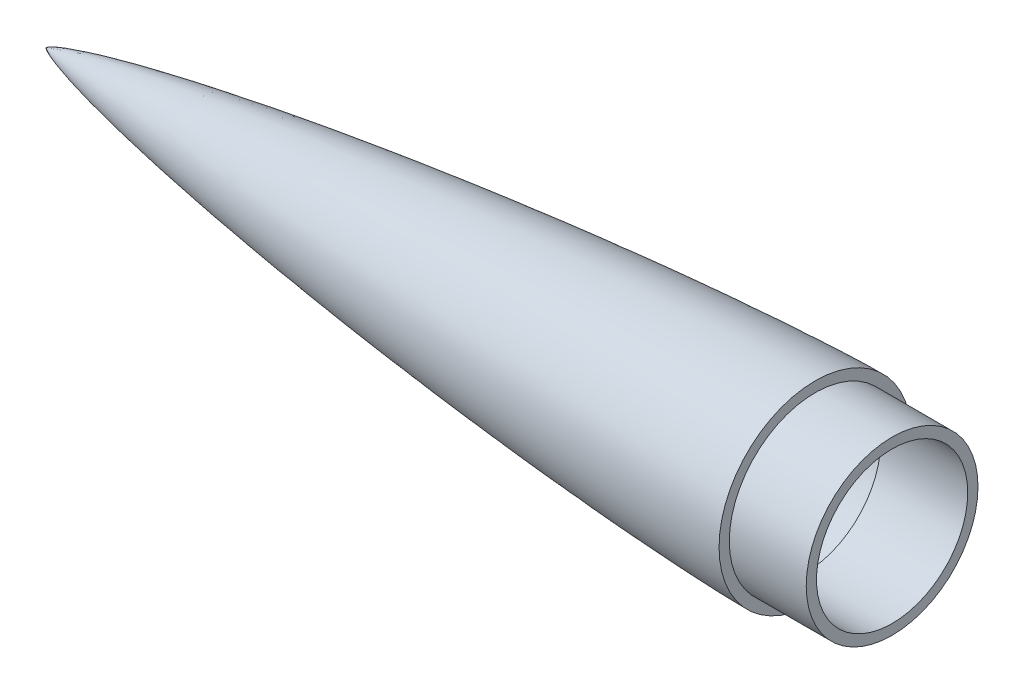
ISO-10303-21;
HEADER;
FILE_DESCRIPTION(('STEP AP214'),'2;1');
FILE_NAME('part.step','',(''),(''),'','','');
FILE_SCHEMA(('AUTOMOTIVE_DESIGN { 1 0 10303 214 1 1 1 1 }'));
ENDSEC;
DATA;
#1=APPLICATION_CONTEXT('core data for automotive mechanical design processes');
#2=APPLICATION_PROTOCOL_DEFINITION('international standard','automotive_design',2000,#1);
#3=PRODUCT_CONTEXT('',#1,'mechanical');
#4=PRODUCT('Part','Part','',(#3));
#5=PRODUCT_RELATED_PRODUCT_CATEGORY('part','',(#4));
#6=PRODUCT_DEFINITION_FORMATION('','',#4);
#7=PRODUCT_DEFINITION_CONTEXT('part definition',#1,'design');
#8=PRODUCT_DEFINITION('design','',#6,#7);
#9=PRODUCT_DEFINITION_SHAPE('','',#8);
#10=(LENGTH_UNIT() NAMED_UNIT(*) SI_UNIT(.MILLI.,.METRE.));
#11=(NAMED_UNIT(*) PLANE_ANGLE_UNIT() SI_UNIT($,.RADIAN.));
#12=(NAMED_UNIT(*) SI_UNIT($,.STERADIAN.) SOLID_ANGLE_UNIT());
#13=UNCERTAINTY_MEASURE_WITH_UNIT(LENGTH_MEASURE(1.E-05),#10,'distance_accuracy_value','');
#14=(GEOMETRIC_REPRESENTATION_CONTEXT(3) GLOBAL_UNCERTAINTY_ASSIGNED_CONTEXT((#13)) GLOBAL_UNIT_ASSIGNED_CONTEXT((#10,
#11,#12)) REPRESENTATION_CONTEXT('',''));
#15=CARTESIAN_POINT('',(0.,0.,0.));
#16=DIRECTION('',(0.,0.,1.));
#17=DIRECTION('',(1.,0.,0.));
#18=AXIS2_PLACEMENT_3D('',#15,#16,#17);
#19=CARTESIAN_POINT('',(300.,37.5,0.));
#20=CARTESIAN_POINT('',(299.053924011818,37.4971739403759,0.));
#21=CARTESIAN_POINT('',(297.161873744708,37.4748411293635,0.));
#22=CARTESIAN_POINT('',(293.378169918809,37.4058641006294,0.));
#23=CARTESIAN_POINT('',(284.902330546139,37.1715530458375,0.));
#24=CARTESIAN_POINT('',(272.684228342787,36.682095727306,0.));
#25=CARTESIAN_POINT('',(256.729777817299,35.8426847412045,0.));
#26=CARTESIAN_POINT('',(237.990103526241,34.629024109173,0.));
#27=CARTESIAN_POINT('',(219.264008612003,33.2226523904283,0.));
#28=CARTESIAN_POINT('',(200.551861462531,31.6417996554157,0.));
#29=CARTESIAN_POINT('',(181.854350055617,29.896724752738,0.));
#30=CARTESIAN_POINT('',(163.172446392856,27.991682268909,0.));
#31=CARTESIAN_POINT('',(144.507625807184,25.926105289295,0.));
#32=CARTESIAN_POINT('',(125.861806117259,23.6950271596646,0.));
#33=CARTESIAN_POINT('',(107.23796061422,21.2874599804908,0.));
#34=CARTESIAN_POINT('',(88.6400136580042,18.6862372553811,0.));
#35=CARTESIAN_POINT('',(70.074710105843,15.8612974837844,0.));
#36=CARTESIAN_POINT('',(51.55196809468,12.7664940875388,0.));
#37=CARTESIAN_POINT('',(35.2610152204738,9.71678375401304,0.));
#38=CARTESIAN_POINT('',(22.6179035144936,7.02588844044319,0.));
#39=CARTESIAN_POINT('',(14.6256838719045,5.05911016812515,0.));
#40=CARTESIAN_POINT('',(11.2138849785522,4.13382901726001,0.));
#41=CARTESIAN_POINT('',(10.2068583356958,3.8508647596265,0.));
#42=B_SPLINE_CURVE_WITH_KNOTS('',4,(#19,#20,#21,#22,#23,#24,#25,#26,#27,#28,#29,#30,#31,#32,#33,
#34,#35,#36,#37,#38,#39,#40,#41),.UNSPECIFIED.,.F.,.F.,(5,1,1,1,1,1,1,1,1,1,1,1,1,1,1,1,1,1,1,
5),(0.,0.0124834695626188,0.0249669391252375,0.049933878250475,0.111879608590109,
0.173825337087147,0.235771067104224,0.297716795626243,0.359662526340917,0.421608254246319,
0.483553983342822,0.545499713482553,0.607445443480169,0.669391171804991,0.731336900866697,
0.793282631355366,0.855228352690804,0.917174087361943,0.950014131685463,0.963816445688512),.UNSPECIFIED.);
#43=CARTESIAN_POINT('',(0.,0.,0.));
#44=DIRECTION('',(-1.,0.,0.));
#45=AXIS1_PLACEMENT('',#43,#44);
#46=SURFACE_OF_REVOLUTION('',#42,#45);
#47=OFFSET_SURFACE('',#46,-4.,.F.);
#48=CARTESIAN_POINT('',(11.2889122174719,0.,0.));
#49=VERTEX_POINT('',#48);
#50=VERTEX_LOOP('',#49);
#51=FACE_BOUND('',#50,.T.);
#52=CARTESIAN_POINT('',(296.,0.,0.));
#53=DIRECTION('',(-1.,0.,0.));
#54=DIRECTION('',(0.,0.,1.));
#55=AXIS2_PLACEMENT_3D('',#52,#53,#54);
#56=CIRCLE('',#55,33.4503954904913);
#57=CARTESIAN_POINT('',(296.,0.,33.4503954904913));
#58=VERTEX_POINT('',#57);
#59=EDGE_CURVE('E46',#58,#58,#56,.T.);
#60=ORIENTED_EDGE('',*,*,#59,.F.);
#61=EDGE_LOOP('',(#60));
#62=FACE_BOUND('',#61,.T.);
#63=ADVANCED_FACE('F38',(#51,#62),#47,.F.);
#64=CARTESIAN_POINT('',(296.,0.,0.));
#65=DIRECTION('',(-1.,0.,0.));
#66=DIRECTION('',(0.,0.,1.));
#67=AXIS2_PLACEMENT_3D('',#64,#65,#66);
#68=PLANE('',#67);
#69=CARTESIAN_POINT('',(296.,0.,0.));
#70=DIRECTION('',(-1.,0.,0.));
#71=DIRECTION('',(0.,0.,1.));
#72=AXIS2_PLACEMENT_3D('',#69,#70,#71);
#73=CIRCLE('',#72,29.5);
#74=CARTESIAN_POINT('',(296.,0.,29.5));
#75=VERTEX_POINT('',#74);
#76=EDGE_CURVE('E103',#75,#75,#73,.F.);
#77=ORIENTED_EDGE('',*,*,#76,.T.);
#78=EDGE_LOOP('',(#77));
#79=FACE_BOUND('',#78,.T.);
#80=ORIENTED_EDGE('',*,*,#59,.T.);
#81=EDGE_LOOP('',(#80));
#82=FACE_BOUND('',#81,.T.);
#83=ADVANCED_FACE('F40',(#79,#82),#68,.T.);
#84=CARTESIAN_POINT('',(-0.000999999999973245,0.,0.));
#85=DIRECTION('',(1.,0.,0.));
#86=DIRECTION('',(0.,0.,-1.));
#87=AXIS2_PLACEMENT_3D('',#84,#85,#86);
#88=CYLINDRICAL_SURFACE('',#87,29.5);
#89=ORIENTED_EDGE('',*,*,#76,.F.);
#90=EDGE_LOOP('',(#89));
#91=FACE_BOUND('',#90,.T.);
#92=CARTESIAN_POINT('',(330.,0.,0.));
#93=DIRECTION('',(1.,0.,0.));
#94=DIRECTION('',(0.,0.,-1.));
#95=AXIS2_PLACEMENT_3D('',#92,#93,#94);
#96=CIRCLE('',#95,29.5);
#97=CARTESIAN_POINT('',(330.,0.,-29.5));
#98=VERTEX_POINT('',#97);
#99=EDGE_CURVE('E66',#98,#98,#96,.T.);
#100=ORIENTED_EDGE('',*,*,#99,.T.);
#101=EDGE_LOOP('',(#100));
#102=FACE_BOUND('',#101,.T.);
#103=ADVANCED_FACE('F56',(#91,#102),#88,.F.);
#104=CARTESIAN_POINT('',(300.,37.5,0.));
#105=CARTESIAN_POINT('',(299.053924011818,37.4971739403759,0.));
#106=CARTESIAN_POINT('',(297.161873744708,37.4748411293635,0.));
#107=CARTESIAN_POINT('',(293.378169918809,37.4058641006294,0.));
#108=CARTESIAN_POINT('',(284.902330546139,37.1715530458375,0.));
#109=CARTESIAN_POINT('',(272.684228342787,36.682095727306,0.));
#110=CARTESIAN_POINT('',(256.729777817299,35.8426847412045,0.));
#111=CARTESIAN_POINT('',(237.990103526241,34.629024109173,0.));
#112=CARTESIAN_POINT('',(219.264008612003,33.2226523904283,0.));
#113=CARTESIAN_POINT('',(200.551861462531,31.6417996554157,0.));
#114=CARTESIAN_POINT('',(181.854350055617,29.896724752738,0.));
#115=CARTESIAN_POINT('',(163.172446392856,27.991682268909,0.));
#116=CARTESIAN_POINT('',(144.507625807184,25.926105289295,0.));
#117=CARTESIAN_POINT('',(125.861806117259,23.6950271596646,0.));
#118=CARTESIAN_POINT('',(107.23796061422,21.2874599804908,0.));
#119=CARTESIAN_POINT('',(88.6400136580042,18.6862372553811,0.));
#120=CARTESIAN_POINT('',(70.074710105843,15.8612974837844,0.));
#121=CARTESIAN_POINT('',(51.55196809468,12.7664940875388,0.));
#122=CARTESIAN_POINT('',(35.2610152204738,9.71678375401304,0.));
#123=CARTESIAN_POINT('',(22.0320807054232,6.90120490618604,0.));
#124=CARTESIAN_POINT('',(12.583389004723,4.55296660898076,0.));
#125=CARTESIAN_POINT('',(7.26310775238099,3.0256529109482,0.));
#126=CARTESIAN_POINT('',(4.10539008591153,1.9738419476301,0.));
#127=CARTESIAN_POINT('',(2.38278619939278,1.31159831302358,0.));
#128=CARTESIAN_POINT('',(1.43687490091439,0.896846557785503,0.));
#129=CARTESIAN_POINT('',(0.89756851882891,0.629376705197313,0.));
#130=CARTESIAN_POINT('',(0.578613323697114,0.452535984730929,0.));
#131=CARTESIAN_POINT('',(0.387460909030794,0.334827052271903,0.));
#132=CARTESIAN_POINT('',(0.260848460841596,0.248758489198538,0.));
#133=CARTESIAN_POINT('',(0.168313709014921,0.179368917364162,0.));
#134=CARTESIAN_POINT('',(0.104176490222134,0.125968337279301,0.));
#135=CARTESIAN_POINT('',(0.0552424717720667,0.0791570260129427,0.));
#136=CARTESIAN_POINT('',(0.0216728347720757,0.0396364118190024,0.));
#137=CARTESIAN_POINT('',(0.00713207777425987,0.0180474263577413,0.));
#138=CARTESIAN_POINT('',(0.00202957358175542,0.00618700622178298,0.));
#139=CARTESIAN_POINT('',(0.,0.,0.));
#140=B_SPLINE_CURVE_WITH_KNOTS('',4,(#104,#105,#106,#107,#108,#109,#110,#111,#112,#113,#114,
#115,#116,#117,#118,#119,#120,#121,#122,#123,#124,#125,#126,#127,#128,#129,#130,#131,#132,#133,
#134,#135,#136,#137,#138,#139),.UNSPECIFIED.,.F.,.F.,(5,1,1,1,1,1,1,1,1,1,1,1,1,1,1,1,1,1,1,1,1,
1,1,1,1,1,1,1,1,1,1,1,5),(0.,0.0124834695626188,0.0249669391252375,0.049933878250475,
0.111879608590109,0.173825337087147,0.235771067104224,0.297716795626243,0.359662526340917,
0.421608254246319,0.483553983342822,0.545499713482553,0.607445443480169,0.669391171804991,
0.731336900866697,0.793282631355366,0.855228352690804,0.917174087361943,0.950014131685463,
0.971718187006424,0.983673349968075,0.990192351699562,0.993917623808536,0.99606156190609,
0.997297176824631,0.998132711635264,0.998728421520602,0.99902254586944,0.999316670218278,
0.999658335109139,0.99982916755457,0.999914583777285,1.),.UNSPECIFIED.);
#141=CARTESIAN_POINT('',(0.,0.,0.));
#142=DIRECTION('',(-1.,0.,0.));
#143=AXIS1_PLACEMENT('',#141,#142);
#144=SURFACE_OF_REVOLUTION('',#140,#143);
#145=CARTESIAN_POINT('',(0.,0.,0.));
#146=VERTEX_POINT('',#145);
#147=VERTEX_LOOP('',#146);
#148=FACE_BOUND('',#147,.T.);
#149=CARTESIAN_POINT('',(300.,0.,0.));
#150=DIRECTION('',(-1.,0.,0.));
#151=DIRECTION('',(0.,0.,1.));
#152=AXIS2_PLACEMENT_3D('',#149,#150,#151);
#153=CIRCLE('',#152,37.5);
#154=CARTESIAN_POINT('',(300.,0.,37.5));
#155=VERTEX_POINT('',#154);
#156=EDGE_CURVE('E60',#155,#155,#153,.T.);
#157=ORIENTED_EDGE('',*,*,#156,.T.);
#158=EDGE_LOOP('',(#157));
#159=FACE_BOUND('',#158,.T.);
#160=ADVANCED_FACE('F52',(#148,#159),#144,.T.);
#161=CARTESIAN_POINT('',(300.,0.,0.));
#162=DIRECTION('',(-1.,0.,0.));
#163=DIRECTION('',(0.,0.,1.));
#164=AXIS2_PLACEMENT_3D('',#161,#162,#163);
#165=PLANE('',#164);
#166=CARTESIAN_POINT('',(300.,0.,0.));
#167=DIRECTION('',(-1.,0.,0.));
#168=DIRECTION('',(0.,0.,1.));
#169=AXIS2_PLACEMENT_3D('',#166,#167,#168);
#170=CIRCLE('',#169,33.5);
#171=CARTESIAN_POINT('',(300.,0.,33.5));
#172=VERTEX_POINT('',#171);
#173=EDGE_CURVE('E11',#172,#172,#170,.F.);
#174=ORIENTED_EDGE('',*,*,#173,.F.);
#175=EDGE_LOOP('',(#174));
#176=FACE_BOUND('',#175,.T.);
#177=ORIENTED_EDGE('',*,*,#156,.F.);
#178=EDGE_LOOP('',(#177));
#179=FACE_BOUND('',#178,.T.);
#180=ADVANCED_FACE('F55',(#176,#179),#165,.F.);
#181=CARTESIAN_POINT('',(330.,0.,0.));
#182=DIRECTION('',(-1.,0.,0.));
#183=DIRECTION('',(0.,0.,1.));
#184=AXIS2_PLACEMENT_3D('',#181,#182,#183);
#185=CYLINDRICAL_SURFACE('',#184,33.5);
#186=CARTESIAN_POINT('',(330.,0.,0.));
#187=DIRECTION('',(1.,0.,0.));
#188=DIRECTION('',(0.,0.,-1.));
#189=AXIS2_PLACEMENT_3D('',#186,#187,#188);
#190=CIRCLE('',#189,33.5);
#191=CARTESIAN_POINT('',(330.,0.,-33.5));
#192=VERTEX_POINT('',#191);
#193=EDGE_CURVE('E62',#192,#192,#190,.T.);
#194=ORIENTED_EDGE('',*,*,#193,.F.);
#195=EDGE_LOOP('',(#194));
#196=FACE_BOUND('',#195,.T.);
#197=ORIENTED_EDGE('',*,*,#173,.T.);
#198=EDGE_LOOP('',(#197));
#199=FACE_BOUND('',#198,.T.);
#200=ADVANCED_FACE('F85',(#196,#199),#185,.T.);
#201=CARTESIAN_POINT('',(330.,0.,0.));
#202=DIRECTION('',(1.,0.,0.));
#203=DIRECTION('',(0.,0.,-1.));
#204=AXIS2_PLACEMENT_3D('',#201,#202,#203);
#205=PLANE('',#204);
#206=ORIENTED_EDGE('',*,*,#99,.F.);
#207=EDGE_LOOP('',(#206));
#208=FACE_BOUND('',#207,.T.);
#209=ORIENTED_EDGE('',*,*,#193,.T.);
#210=EDGE_LOOP('',(#209));
#211=FACE_BOUND('',#210,.T.);
#212=ADVANCED_FACE('F89',(#208,#211),#205,.T.);
#213=CLOSED_SHELL('',(#63,#83,#103,#160,#180,#200,#212));
#214=MANIFOLD_SOLID_BREP('B2',#213);
#215=ADVANCED_BREP_SHAPE_REPRESENTATION('',(#18,#214),#14);
#216=SHAPE_DEFINITION_REPRESENTATION(#9,#215);
ENDSEC;
END-ISO-10303-21;
